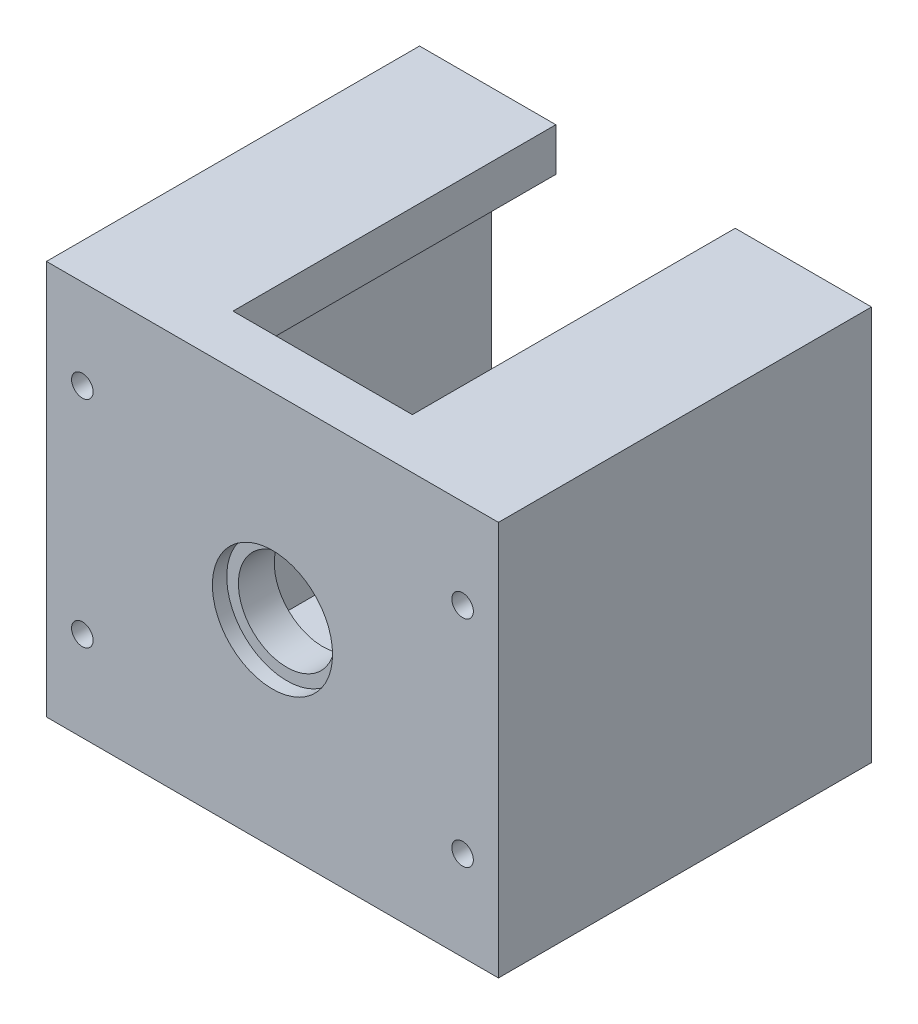
ISO-10303-21;
HEADER;
FILE_DESCRIPTION(('STEP AP214'),'2;1');
FILE_NAME('part.step','',(''),(''),'','','');
FILE_SCHEMA(('AUTOMOTIVE_DESIGN { 1 0 10303 214 1 1 1 1 }'));
ENDSEC;
DATA;
#1=APPLICATION_CONTEXT('core data for automotive mechanical design processes');
#2=APPLICATION_PROTOCOL_DEFINITION('international standard','automotive_design',2000,#1);
#3=PRODUCT_CONTEXT('',#1,'mechanical');
#4=PRODUCT('Part','Part','',(#3));
#5=PRODUCT_RELATED_PRODUCT_CATEGORY('part','',(#4));
#6=PRODUCT_DEFINITION_FORMATION('','',#4);
#7=PRODUCT_DEFINITION_CONTEXT('part definition',#1,'design');
#8=PRODUCT_DEFINITION('design','',#6,#7);
#9=PRODUCT_DEFINITION_SHAPE('','',#8);
#10=(LENGTH_UNIT() NAMED_UNIT(*) SI_UNIT(.MILLI.,.METRE.));
#11=(NAMED_UNIT(*) PLANE_ANGLE_UNIT() SI_UNIT($,.RADIAN.));
#12=(NAMED_UNIT(*) SI_UNIT($,.STERADIAN.) SOLID_ANGLE_UNIT());
#13=UNCERTAINTY_MEASURE_WITH_UNIT(LENGTH_MEASURE(1.E-05),#10,'distance_accuracy_value','');
#14=(GEOMETRIC_REPRESENTATION_CONTEXT(3) GLOBAL_UNCERTAINTY_ASSIGNED_CONTEXT((#13)) GLOBAL_UNIT_ASSIGNED_CONTEXT((#10,
#11,#12)) REPRESENTATION_CONTEXT('',''));
#15=CARTESIAN_POINT('',(0.,0.,0.));
#16=DIRECTION('',(0.,0.,1.));
#17=DIRECTION('',(1.,0.,0.));
#18=AXIS2_PLACEMENT_3D('',#15,#16,#17);
#19=CARTESIAN_POINT('',(0.,43.,-45.));
#20=DIRECTION('',(0.,-1.,0.));
#21=DIRECTION('',(0.,0.,-1.));
#22=AXIS2_PLACEMENT_3D('',#19,#20,#21);
#23=PLANE('',#22);
#24=DIRECTION('',(1.,0.,0.));
#25=VECTOR('',#24,1.);
#26=CARTESIAN_POINT('',(0.,43.,-45.));
#27=LINE('',#26,#25);
#28=CARTESIAN_POINT('',(0.,43.,-45.));
#29=VERTEX_POINT('',#28);
#30=CARTESIAN_POINT('',(8.99999999999999,43.,-45.));
#31=VERTEX_POINT('',#30);
#32=EDGE_CURVE('E229',#29,#31,#27,.T.);
#33=ORIENTED_EDGE('',*,*,#32,.T.);
#34=DIRECTION('',(0.,0.,1.));
#35=VECTOR('',#34,1.);
#36=CARTESIAN_POINT('',(8.99999999999999,43.,0.));
#37=LINE('',#36,#35);
#38=CARTESIAN_POINT('',(8.99999999999999,43.,0.));
#39=VERTEX_POINT('',#38);
#40=EDGE_CURVE('E50',#31,#39,#37,.T.);
#41=ORIENTED_EDGE('',*,*,#40,.T.);
#42=DIRECTION('',(1.,0.,0.));
#43=VECTOR('',#42,1.);
#44=CARTESIAN_POINT('',(0.,43.,0.));
#45=LINE('',#44,#43);
#46=CARTESIAN_POINT('',(0.,43.,0.));
#47=VERTEX_POINT('',#46);
#48=EDGE_CURVE('E170',#47,#39,#45,.T.);
#49=ORIENTED_EDGE('',*,*,#48,.F.);
#50=DIRECTION('',(0.,0.,1.));
#51=VECTOR('',#50,1.);
#52=CARTESIAN_POINT('',(0.,43.,-45.));
#53=LINE('',#52,#51);
#54=EDGE_CURVE('E177',#29,#47,#53,.T.);
#55=ORIENTED_EDGE('',*,*,#54,.F.);
#56=EDGE_LOOP('',(#33,#41,#49,#55));
#57=FACE_BOUND('',#56,.T.);
#58=ADVANCED_FACE('F35',(#57),#23,.T.);
#59=CARTESIAN_POINT('',(0.,0.,0.));
#60=DIRECTION('',(0.,0.,1.));
#61=DIRECTION('',(1.,0.,0.));
#62=AXIS2_PLACEMENT_3D('',#59,#60,#61);
#63=PLANE('',#62);
#64=DIRECTION('',(0.,1.,0.));
#65=VECTOR('',#64,1.);
#66=CARTESIAN_POINT('',(43.,0.,0.));
#67=LINE('',#66,#65);
#68=CARTESIAN_POINT('',(43.,0.,0.));
#69=VERTEX_POINT('',#68);
#70=CARTESIAN_POINT('',(43.,43.,0.));
#71=VERTEX_POINT('',#70);
#72=EDGE_CURVE('E161',#69,#71,#67,.T.);
#73=ORIENTED_EDGE('',*,*,#72,.F.);
#74=DIRECTION('',(1.,0.,0.));
#75=VECTOR('',#74,1.);
#76=CARTESIAN_POINT('',(0.,0.,0.));
#77=LINE('',#76,#75);
#78=CARTESIAN_POINT('',(0.,0.,0.));
#79=VERTEX_POINT('',#78);
#80=EDGE_CURVE('E164',#79,#69,#77,.T.);
#81=ORIENTED_EDGE('',*,*,#80,.F.);
#82=DIRECTION('',(0.,1.,0.));
#83=VECTOR('',#82,1.);
#84=CARTESIAN_POINT('',(0.,0.,0.));
#85=LINE('',#84,#83);
#86=EDGE_CURVE('E168',#79,#47,#85,.T.);
#87=ORIENTED_EDGE('',*,*,#86,.T.);
#88=ORIENTED_EDGE('',*,*,#48,.T.);
#89=DIRECTION('',(0.,-1.,0.));
#90=VECTOR('',#89,1.);
#91=CARTESIAN_POINT('',(8.99999999999999,100.478150704935,0.));
#92=LINE('',#91,#90);
#93=CARTESIAN_POINT('',(8.99999999999999,49.,0.));
#94=VERTEX_POINT('',#93);
#95=EDGE_CURVE('E253',#94,#39,#92,.T.);
#96=ORIENTED_EDGE('',*,*,#95,.F.);
#97=DIRECTION('',(-1.,0.,0.));
#98=VECTOR('',#97,1.);
#99=CARTESIAN_POINT('',(0.,49.,0.));
#100=LINE('',#99,#98);
#101=CARTESIAN_POINT('',(34.,49.,0.));
#102=VERTEX_POINT('',#101);
#103=EDGE_CURVE('E140',#102,#94,#100,.T.);
#104=ORIENTED_EDGE('',*,*,#103,.F.);
#105=DIRECTION('',(0.,-1.,0.));
#106=VECTOR('',#105,1.);
#107=CARTESIAN_POINT('',(34.,100.478150704935,0.));
#108=LINE('',#107,#106);
#109=CARTESIAN_POINT('',(34.,43.,0.));
#110=VERTEX_POINT('',#109);
#111=EDGE_CURVE('E257',#102,#110,#108,.T.);
#112=ORIENTED_EDGE('',*,*,#111,.T.);
#113=EDGE_CURVE('E58',#110,#71,#45,.T.);
#114=ORIENTED_EDGE('',*,*,#113,.T.);
#115=EDGE_LOOP('',(#73,#81,#87,#88,#96,#104,#112,#114));
#116=FACE_BOUND('',#115,.T.);
#117=CARTESIAN_POINT('',(21.5,21.5,0.));
#118=DIRECTION('',(0.,0.,1.));
#119=DIRECTION('',(1.,0.,0.));
#120=AXIS2_PLACEMENT_3D('',#117,#118,#119);
#121=CIRCLE('',#120,6.75);
#122=CARTESIAN_POINT('',(28.25,21.5,0.));
#123=VERTEX_POINT('',#122);
#124=EDGE_CURVE('E141',#123,#123,#121,.T.);
#125=ORIENTED_EDGE('',*,*,#124,.T.);
#126=EDGE_LOOP('',(#125));
#127=FACE_BOUND('',#126,.T.);
#128=ADVANCED_FACE('F273',(#116,#127),#63,.F.);
#129=CARTESIAN_POINT('',(0.,-6.00000000000001,7.));
#130=DIRECTION('',(0.,1.,0.));
#131=DIRECTION('',(-1.,0.,0.));
#132=AXIS2_PLACEMENT_3D('',#129,#130,#131);
#133=PLANE('',#132);
#134=DIRECTION('',(0.,0.,-1.));
#135=VECTOR('',#134,1.);
#136=CARTESIAN_POINT('',(-10.,-6.00000000000001,7.));
#137=LINE('',#136,#135);
#138=CARTESIAN_POINT('',(-10.,-6.00000000000001,7.));
#139=VERTEX_POINT('',#138);
#140=CARTESIAN_POINT('',(-10.,-6.00000000000001,-45.));
#141=VERTEX_POINT('',#140);
#142=EDGE_CURVE('E210',#139,#141,#137,.T.);
#143=ORIENTED_EDGE('',*,*,#142,.T.);
#144=DIRECTION('',(1.,0.,0.));
#145=VECTOR('',#144,1.);
#146=CARTESIAN_POINT('',(0.,-6.00000000000001,-45.));
#147=LINE('',#146,#145);
#148=CARTESIAN_POINT('',(53.,-6.,-45.));
#149=VERTEX_POINT('',#148);
#150=EDGE_CURVE('E225',#141,#149,#147,.T.);
#151=ORIENTED_EDGE('',*,*,#150,.T.);
#152=DIRECTION('',(0.,0.,-1.));
#153=VECTOR('',#152,1.);
#154=CARTESIAN_POINT('',(53.,-6.,7.));
#155=LINE('',#154,#153);
#156=CARTESIAN_POINT('',(53.,-6.,7.));
#157=VERTEX_POINT('',#156);
#158=EDGE_CURVE('E43',#157,#149,#155,.T.);
#159=ORIENTED_EDGE('',*,*,#158,.F.);
#160=DIRECTION('',(1.,0.,0.));
#161=VECTOR('',#160,1.);
#162=CARTESIAN_POINT('',(0.,-6.00000000000001,7.));
#163=LINE('',#162,#161);
#164=EDGE_CURVE('E193',#139,#157,#163,.T.);
#165=ORIENTED_EDGE('',*,*,#164,.F.);
#166=EDGE_LOOP('',(#143,#151,#159,#165));
#167=FACE_BOUND('',#166,.T.);
#168=ADVANCED_FACE('F228',(#167),#133,.F.);
#169=CARTESIAN_POINT('',(53.,0.,7.));
#170=DIRECTION('',(-1.,0.,0.));
#171=DIRECTION('',(0.,-1.,0.));
#172=AXIS2_PLACEMENT_3D('',#169,#170,#171);
#173=PLANE('',#172);
#174=ORIENTED_EDGE('',*,*,#158,.T.);
#175=DIRECTION('',(0.,1.,0.));
#176=VECTOR('',#175,1.);
#177=CARTESIAN_POINT('',(53.,0.,-45.));
#178=LINE('',#177,#176);
#179=CARTESIAN_POINT('',(53.,49.,-45.));
#180=VERTEX_POINT('',#179);
#181=EDGE_CURVE('E154',#149,#180,#178,.T.);
#182=ORIENTED_EDGE('',*,*,#181,.T.);
#183=DIRECTION('',(0.,0.,-1.));
#184=VECTOR('',#183,1.);
#185=CARTESIAN_POINT('',(53.,49.,7.));
#186=LINE('',#185,#184);
#187=CARTESIAN_POINT('',(53.,49.,7.));
#188=VERTEX_POINT('',#187);
#189=EDGE_CURVE('E214',#188,#180,#186,.T.);
#190=ORIENTED_EDGE('',*,*,#189,.F.);
#191=DIRECTION('',(0.,1.,0.));
#192=VECTOR('',#191,1.);
#193=CARTESIAN_POINT('',(53.,0.,7.));
#194=LINE('',#193,#192);
#195=EDGE_CURVE('E196',#157,#188,#194,.T.);
#196=ORIENTED_EDGE('',*,*,#195,.F.);
#197=EDGE_LOOP('',(#174,#182,#190,#196));
#198=FACE_BOUND('',#197,.T.);
#199=ADVANCED_FACE('F220',(#198),#173,.F.);
#200=CARTESIAN_POINT('',(0.,49.,7.));
#201=DIRECTION('',(0.,1.,0.));
#202=DIRECTION('',(-1.,0.,0.));
#203=AXIS2_PLACEMENT_3D('',#200,#201,#202);
#204=PLANE('',#203);
#205=DIRECTION('',(0.,0.,1.));
#206=VECTOR('',#205,1.);
#207=CARTESIAN_POINT('',(34.,49.,0.));
#208=LINE('',#207,#206);
#209=CARTESIAN_POINT('',(34.,49.,-45.));
#210=VERTEX_POINT('',#209);
#211=EDGE_CURVE('E254',#210,#102,#208,.T.);
#212=ORIENTED_EDGE('',*,*,#211,.T.);
#213=ORIENTED_EDGE('',*,*,#103,.T.);
#214=DIRECTION('',(0.,0.,1.));
#215=VECTOR('',#214,1.);
#216=CARTESIAN_POINT('',(8.99999999999999,49.,0.));
#217=LINE('',#216,#215);
#218=CARTESIAN_POINT('',(8.99999999999999,49.,-45.));
#219=VERTEX_POINT('',#218);
#220=EDGE_CURVE('E125',#219,#94,#217,.T.);
#221=ORIENTED_EDGE('',*,*,#220,.F.);
#222=DIRECTION('',(1.,0.,0.));
#223=VECTOR('',#222,1.);
#224=CARTESIAN_POINT('',(0.,49.,-45.));
#225=LINE('',#224,#223);
#226=CARTESIAN_POINT('',(-10.,49.,-45.));
#227=VERTEX_POINT('',#226);
#228=EDGE_CURVE('E137',#227,#219,#225,.T.);
#229=ORIENTED_EDGE('',*,*,#228,.F.);
#230=DIRECTION('',(0.,0.,-1.));
#231=VECTOR('',#230,1.);
#232=CARTESIAN_POINT('',(-10.,49.,7.));
#233=LINE('',#232,#231);
#234=CARTESIAN_POINT('',(-10.,49.,7.));
#235=VERTEX_POINT('',#234);
#236=EDGE_CURVE('E212',#235,#227,#233,.T.);
#237=ORIENTED_EDGE('',*,*,#236,.F.);
#238=DIRECTION('',(1.,0.,0.));
#239=VECTOR('',#238,1.);
#240=CARTESIAN_POINT('',(0.,49.,7.));
#241=LINE('',#240,#239);
#242=EDGE_CURVE('E198',#235,#188,#241,.T.);
#243=ORIENTED_EDGE('',*,*,#242,.T.);
#244=ORIENTED_EDGE('',*,*,#189,.T.);
#245=EDGE_CURVE('E150',#210,#180,#225,.T.);
#246=ORIENTED_EDGE('',*,*,#245,.F.);
#247=EDGE_LOOP('',(#212,#213,#221,#229,#237,#243,#244,#246));
#248=FACE_BOUND('',#247,.T.);
#249=ADVANCED_FACE('F136',(#248),#204,.T.);
#250=CARTESIAN_POINT('',(48.,36.5,7.));
#251=DIRECTION('',(0.,0.,-1.));
#252=DIRECTION('',(-1.,0.,0.));
#253=AXIS2_PLACEMENT_3D('',#250,#251,#252);
#254=CYLINDRICAL_SURFACE('',#253,1.50000000000001);
#255=CARTESIAN_POINT('',(48.,36.5,7.));
#256=DIRECTION('',(0.,0.,1.));
#257=DIRECTION('',(1.,0.,0.));
#258=AXIS2_PLACEMENT_3D('',#255,#256,#257);
#259=CIRCLE('',#258,1.50000000000001);
#260=CARTESIAN_POINT('',(49.5,36.5,7.));
#261=VERTEX_POINT('',#260);
#262=EDGE_CURVE('E204',#261,#261,#259,.F.);
#263=ORIENTED_EDGE('',*,*,#262,.F.);
#264=EDGE_LOOP('',(#263));
#265=FACE_BOUND('',#264,.T.);
#266=CARTESIAN_POINT('',(48.,36.5,-45.));
#267=DIRECTION('',(0.,0.,1.));
#268=DIRECTION('',(1.,0.,0.));
#269=AXIS2_PLACEMENT_3D('',#266,#267,#268);
#270=CIRCLE('',#269,1.50000000000001);
#271=CARTESIAN_POINT('',(49.5,36.5,-45.));
#272=VERTEX_POINT('',#271);
#273=EDGE_CURVE('E152',#272,#272,#270,.F.);
#274=ORIENTED_EDGE('',*,*,#273,.T.);
#275=EDGE_LOOP('',(#274));
#276=FACE_BOUND('',#275,.T.);
#277=ADVANCED_FACE('F293',(#265,#276),#254,.F.);
#278=CARTESIAN_POINT('',(-10.,0.,7.));
#279=DIRECTION('',(-1.,0.,0.));
#280=DIRECTION('',(0.,-1.,0.));
#281=AXIS2_PLACEMENT_3D('',#278,#279,#280);
#282=PLANE('',#281);
#283=ORIENTED_EDGE('',*,*,#236,.T.);
#284=DIRECTION('',(0.,1.,0.));
#285=VECTOR('',#284,1.);
#286=CARTESIAN_POINT('',(-10.,0.,-45.));
#287=LINE('',#286,#285);
#288=EDGE_CURVE('E149',#141,#227,#287,.T.);
#289=ORIENTED_EDGE('',*,*,#288,.F.);
#290=ORIENTED_EDGE('',*,*,#142,.F.);
#291=DIRECTION('',(0.,1.,0.));
#292=VECTOR('',#291,1.);
#293=CARTESIAN_POINT('',(-10.,0.,7.));
#294=LINE('',#293,#292);
#295=EDGE_CURVE('E201',#139,#235,#294,.T.);
#296=ORIENTED_EDGE('',*,*,#295,.T.);
#297=EDGE_LOOP('',(#283,#289,#290,#296));
#298=FACE_BOUND('',#297,.T.);
#299=ADVANCED_FACE('F290',(#298),#282,.T.);
#300=CARTESIAN_POINT('',(-5.,36.5,7.));
#301=DIRECTION('',(0.,0.,-1.));
#302=DIRECTION('',(-1.,0.,0.));
#303=AXIS2_PLACEMENT_3D('',#300,#301,#302);
#304=CYLINDRICAL_SURFACE('',#303,1.5);
#305=CARTESIAN_POINT('',(-5.,36.5,7.));
#306=DIRECTION('',(0.,0.,1.));
#307=DIRECTION('',(1.,0.,0.));
#308=AXIS2_PLACEMENT_3D('',#305,#306,#307);
#309=CIRCLE('',#308,1.5);
#310=CARTESIAN_POINT('',(-3.5,36.5,7.));
#311=VERTEX_POINT('',#310);
#312=EDGE_CURVE('E190',#311,#311,#309,.T.);
#313=ORIENTED_EDGE('',*,*,#312,.T.);
#314=EDGE_LOOP('',(#313));
#315=FACE_BOUND('',#314,.T.);
#316=CARTESIAN_POINT('',(-5.,36.5,-45.));
#317=DIRECTION('',(0.,0.,1.));
#318=DIRECTION('',(1.,0.,0.));
#319=AXIS2_PLACEMENT_3D('',#316,#317,#318);
#320=CIRCLE('',#319,1.5);
#321=CARTESIAN_POINT('',(-3.5,36.5,-45.));
#322=VERTEX_POINT('',#321);
#323=EDGE_CURVE('E241',#322,#322,#320,.T.);
#324=ORIENTED_EDGE('',*,*,#323,.F.);
#325=EDGE_LOOP('',(#324));
#326=FACE_BOUND('',#325,.T.);
#327=ADVANCED_FACE('F292',(#315,#326),#304,.F.);
#328=CARTESIAN_POINT('',(-5.,6.49999999999999,7.));
#329=DIRECTION('',(0.,0.,-1.));
#330=DIRECTION('',(-1.,0.,0.));
#331=AXIS2_PLACEMENT_3D('',#328,#329,#330);
#332=CYLINDRICAL_SURFACE('',#331,1.5);
#333=CARTESIAN_POINT('',(-5.,6.49999999999999,7.));
#334=DIRECTION('',(0.,0.,1.));
#335=DIRECTION('',(1.,0.,0.));
#336=AXIS2_PLACEMENT_3D('',#333,#334,#335);
#337=CIRCLE('',#336,1.5);
#338=CARTESIAN_POINT('',(-3.5,6.49999999999999,7.));
#339=VERTEX_POINT('',#338);
#340=EDGE_CURVE('E187',#339,#339,#337,.T.);
#341=ORIENTED_EDGE('',*,*,#340,.T.);
#342=EDGE_LOOP('',(#341));
#343=FACE_BOUND('',#342,.T.);
#344=CARTESIAN_POINT('',(-5.,6.49999999999999,-45.));
#345=DIRECTION('',(0.,0.,1.));
#346=DIRECTION('',(1.,0.,0.));
#347=AXIS2_PLACEMENT_3D('',#344,#345,#346);
#348=CIRCLE('',#347,1.5);
#349=CARTESIAN_POINT('',(-3.5,6.49999999999999,-45.));
#350=VERTEX_POINT('',#349);
#351=EDGE_CURVE('E244',#350,#350,#348,.T.);
#352=ORIENTED_EDGE('',*,*,#351,.F.);
#353=EDGE_LOOP('',(#352));
#354=FACE_BOUND('',#353,.T.);
#355=ADVANCED_FACE('F299',(#343,#354),#332,.F.);
#356=CARTESIAN_POINT('',(48.,6.49999999999999,7.));
#357=DIRECTION('',(0.,0.,-1.));
#358=DIRECTION('',(-1.,0.,0.));
#359=AXIS2_PLACEMENT_3D('',#356,#357,#358);
#360=CYLINDRICAL_SURFACE('',#359,1.5);
#361=CARTESIAN_POINT('',(48.,6.49999999999999,7.));
#362=DIRECTION('',(0.,0.,1.));
#363=DIRECTION('',(1.,0.,0.));
#364=AXIS2_PLACEMENT_3D('',#361,#362,#363);
#365=CIRCLE('',#364,1.5);
#366=CARTESIAN_POINT('',(49.5,6.49999999999999,7.));
#367=VERTEX_POINT('',#366);
#368=EDGE_CURVE('E176',#367,#367,#365,.F.);
#369=ORIENTED_EDGE('',*,*,#368,.F.);
#370=EDGE_LOOP('',(#369));
#371=FACE_BOUND('',#370,.T.);
#372=CARTESIAN_POINT('',(48.,6.49999999999999,-45.));
#373=DIRECTION('',(0.,0.,1.));
#374=DIRECTION('',(1.,0.,0.));
#375=AXIS2_PLACEMENT_3D('',#372,#373,#374);
#376=CIRCLE('',#375,1.5);
#377=CARTESIAN_POINT('',(49.5,6.49999999999999,-45.));
#378=VERTEX_POINT('',#377);
#379=EDGE_CURVE('E173',#378,#378,#376,.F.);
#380=ORIENTED_EDGE('',*,*,#379,.T.);
#381=EDGE_LOOP('',(#380));
#382=FACE_BOUND('',#381,.T.);
#383=ADVANCED_FACE('F37',(#371,#382),#360,.F.);
#384=CARTESIAN_POINT('',(21.5,21.5,7.));
#385=DIRECTION('',(0.,0.,-1.));
#386=DIRECTION('',(-1.,0.,0.));
#387=AXIS2_PLACEMENT_3D('',#384,#385,#386);
#388=CYLINDRICAL_SURFACE('',#387,8.375);
#389=CARTESIAN_POINT('',(21.5,21.5,5.));
#390=DIRECTION('',(0.,0.,1.));
#391=DIRECTION('',(1.,0.,0.));
#392=AXIS2_PLACEMENT_3D('',#389,#390,#391);
#393=CIRCLE('',#392,8.375);
#394=CARTESIAN_POINT('',(29.875,21.5,5.));
#395=VERTEX_POINT('',#394);
#396=EDGE_CURVE('E11',#395,#395,#393,.T.);
#397=ORIENTED_EDGE('',*,*,#396,.F.);
#398=EDGE_LOOP('',(#397));
#399=FACE_BOUND('',#398,.T.);
#400=CARTESIAN_POINT('',(21.5,21.5,7.));
#401=DIRECTION('',(0.,0.,1.));
#402=DIRECTION('',(1.,0.,0.));
#403=AXIS2_PLACEMENT_3D('',#400,#401,#402);
#404=CIRCLE('',#403,8.375);
#405=CARTESIAN_POINT('',(29.875,21.5,7.));
#406=VERTEX_POINT('',#405);
#407=EDGE_CURVE('E207',#406,#406,#404,.T.);
#408=ORIENTED_EDGE('',*,*,#407,.T.);
#409=EDGE_LOOP('',(#408));
#410=FACE_BOUND('',#409,.T.);
#411=ADVANCED_FACE('F322',(#399,#410),#388,.F.);
#412=CARTESIAN_POINT('',(0.,0.,7.));
#413=DIRECTION('',(0.,0.,1.));
#414=DIRECTION('',(1.,0.,0.));
#415=AXIS2_PLACEMENT_3D('',#412,#413,#414);
#416=PLANE('',#415);
#417=ORIENTED_EDGE('',*,*,#368,.T.);
#418=EDGE_LOOP('',(#417));
#419=FACE_BOUND('',#418,.T.);
#420=ORIENTED_EDGE('',*,*,#340,.F.);
#421=EDGE_LOOP('',(#420));
#422=FACE_BOUND('',#421,.T.);
#423=ORIENTED_EDGE('',*,*,#312,.F.);
#424=EDGE_LOOP('',(#423));
#425=FACE_BOUND('',#424,.T.);
#426=ORIENTED_EDGE('',*,*,#164,.T.);
#427=ORIENTED_EDGE('',*,*,#195,.T.);
#428=ORIENTED_EDGE('',*,*,#242,.F.);
#429=ORIENTED_EDGE('',*,*,#295,.F.);
#430=EDGE_LOOP('',(#426,#427,#428,#429));
#431=FACE_BOUND('',#430,.T.);
#432=ORIENTED_EDGE('',*,*,#262,.T.);
#433=EDGE_LOOP('',(#432));
#434=FACE_BOUND('',#433,.T.);
#435=ORIENTED_EDGE('',*,*,#407,.F.);
#436=EDGE_LOOP('',(#435));
#437=FACE_BOUND('',#436,.T.);
#438=ADVANCED_FACE('F287',(#419,#422,#425,#431,#434,#437),#416,.T.);
#439=CARTESIAN_POINT('',(43.,0.,-45.));
#440=DIRECTION('',(1.,0.,0.));
#441=DIRECTION('',(0.,0.,-1.));
#442=AXIS2_PLACEMENT_3D('',#439,#440,#441);
#443=PLANE('',#442);
#444=ORIENTED_EDGE('',*,*,#72,.T.);
#445=DIRECTION('',(0.,0.,1.));
#446=VECTOR('',#445,1.);
#447=CARTESIAN_POINT('',(43.,43.,-45.));
#448=LINE('',#447,#446);
#449=CARTESIAN_POINT('',(43.,43.,-45.));
#450=VERTEX_POINT('',#449);
#451=EDGE_CURVE('E174',#450,#71,#448,.T.);
#452=ORIENTED_EDGE('',*,*,#451,.F.);
#453=DIRECTION('',(0.,1.,0.));
#454=VECTOR('',#453,1.);
#455=CARTESIAN_POINT('',(43.,0.,-45.));
#456=LINE('',#455,#454);
#457=CARTESIAN_POINT('',(43.,0.,-45.));
#458=VERTEX_POINT('',#457);
#459=EDGE_CURVE('E238',#458,#450,#456,.T.);
#460=ORIENTED_EDGE('',*,*,#459,.F.);
#461=DIRECTION('',(0.,0.,1.));
#462=VECTOR('',#461,1.);
#463=CARTESIAN_POINT('',(43.,0.,-45.));
#464=LINE('',#463,#462);
#465=EDGE_CURVE('E160',#458,#69,#464,.T.);
#466=ORIENTED_EDGE('',*,*,#465,.T.);
#467=EDGE_LOOP('',(#444,#452,#460,#466));
#468=FACE_BOUND('',#467,.T.);
#469=ADVANCED_FACE('F271',(#468),#443,.F.);
#470=DIRECTION('',(0.,0.,1.));
#471=VECTOR('',#470,1.);
#472=CARTESIAN_POINT('',(34.,43.,0.));
#473=LINE('',#472,#471);
#474=CARTESIAN_POINT('',(34.,43.,-45.));
#475=VERTEX_POINT('',#474);
#476=EDGE_CURVE('E142',#475,#110,#473,.T.);
#477=ORIENTED_EDGE('',*,*,#476,.F.);
#478=EDGE_CURVE('E230',#475,#450,#27,.T.);
#479=ORIENTED_EDGE('',*,*,#478,.T.);
#480=ORIENTED_EDGE('',*,*,#451,.T.);
#481=ORIENTED_EDGE('',*,*,#113,.F.);
#482=EDGE_LOOP('',(#477,#479,#480,#481));
#483=FACE_BOUND('',#482,.T.);
#484=ADVANCED_FACE('F267',(#483),#23,.T.);
#485=CARTESIAN_POINT('',(0.,0.,-45.));
#486=DIRECTION('',(1.,0.,0.));
#487=DIRECTION('',(0.,0.,-1.));
#488=AXIS2_PLACEMENT_3D('',#485,#486,#487);
#489=PLANE('',#488);
#490=ORIENTED_EDGE('',*,*,#86,.F.);
#491=DIRECTION('',(0.,0.,1.));
#492=VECTOR('',#491,1.);
#493=CARTESIAN_POINT('',(0.,0.,-45.));
#494=LINE('',#493,#492);
#495=CARTESIAN_POINT('',(0.,0.,-45.));
#496=VERTEX_POINT('',#495);
#497=EDGE_CURVE('E180',#496,#79,#494,.T.);
#498=ORIENTED_EDGE('',*,*,#497,.F.);
#499=DIRECTION('',(0.,1.,0.));
#500=VECTOR('',#499,1.);
#501=CARTESIAN_POINT('',(0.,0.,-45.));
#502=LINE('',#501,#500);
#503=EDGE_CURVE('E233',#496,#29,#502,.T.);
#504=ORIENTED_EDGE('',*,*,#503,.T.);
#505=ORIENTED_EDGE('',*,*,#54,.T.);
#506=EDGE_LOOP('',(#490,#498,#504,#505));
#507=FACE_BOUND('',#506,.T.);
#508=ADVANCED_FACE('F281',(#507),#489,.T.);
#509=CARTESIAN_POINT('',(0.,0.,-45.));
#510=DIRECTION('',(0.,-1.,0.));
#511=DIRECTION('',(0.,0.,-1.));
#512=AXIS2_PLACEMENT_3D('',#509,#510,#511);
#513=PLANE('',#512);
#514=ORIENTED_EDGE('',*,*,#80,.T.);
#515=ORIENTED_EDGE('',*,*,#465,.F.);
#516=DIRECTION('',(1.,0.,0.));
#517=VECTOR('',#516,1.);
#518=CARTESIAN_POINT('',(0.,0.,-45.));
#519=LINE('',#518,#517);
#520=EDGE_CURVE('E236',#496,#458,#519,.T.);
#521=ORIENTED_EDGE('',*,*,#520,.F.);
#522=ORIENTED_EDGE('',*,*,#497,.T.);
#523=EDGE_LOOP('',(#514,#515,#521,#522));
#524=FACE_BOUND('',#523,.T.);
#525=ADVANCED_FACE('F276',(#524),#513,.F.);
#526=CARTESIAN_POINT('',(0.,0.,-45.));
#527=DIRECTION('',(0.,0.,1.));
#528=DIRECTION('',(1.,0.,0.));
#529=AXIS2_PLACEMENT_3D('',#526,#527,#528);
#530=PLANE('',#529);
#531=ORIENTED_EDGE('',*,*,#379,.F.);
#532=EDGE_LOOP('',(#531));
#533=FACE_BOUND('',#532,.T.);
#534=ORIENTED_EDGE('',*,*,#351,.T.);
#535=EDGE_LOOP('',(#534));
#536=FACE_BOUND('',#535,.T.);
#537=ORIENTED_EDGE('',*,*,#323,.T.);
#538=EDGE_LOOP('',(#537));
#539=FACE_BOUND('',#538,.T.);
#540=ORIENTED_EDGE('',*,*,#478,.F.);
#541=DIRECTION('',(0.,-1.,0.));
#542=VECTOR('',#541,1.);
#543=CARTESIAN_POINT('',(34.,100.478150704935,-45.));
#544=LINE('',#543,#542);
#545=EDGE_CURVE('E131',#210,#475,#544,.T.);
#546=ORIENTED_EDGE('',*,*,#545,.F.);
#547=ORIENTED_EDGE('',*,*,#245,.T.);
#548=ORIENTED_EDGE('',*,*,#181,.F.);
#549=ORIENTED_EDGE('',*,*,#150,.F.);
#550=ORIENTED_EDGE('',*,*,#288,.T.);
#551=ORIENTED_EDGE('',*,*,#228,.T.);
#552=DIRECTION('',(0.,-1.,0.));
#553=VECTOR('',#552,1.);
#554=CARTESIAN_POINT('',(8.99999999999999,100.478150704935,-45.));
#555=LINE('',#554,#553);
#556=EDGE_CURVE('E122',#219,#31,#555,.T.);
#557=ORIENTED_EDGE('',*,*,#556,.T.);
#558=ORIENTED_EDGE('',*,*,#32,.F.);
#559=ORIENTED_EDGE('',*,*,#503,.F.);
#560=ORIENTED_EDGE('',*,*,#520,.T.);
#561=ORIENTED_EDGE('',*,*,#459,.T.);
#562=EDGE_LOOP('',(#540,#546,#547,#548,#549,#550,#551,#557,#558,#559,#560,#561));
#563=FACE_BOUND('',#562,.T.);
#564=ORIENTED_EDGE('',*,*,#273,.F.);
#565=EDGE_LOOP('',(#564));
#566=FACE_BOUND('',#565,.T.);
#567=ADVANCED_FACE('F145',(#533,#536,#539,#563,#566),#530,.F.);
#568=CARTESIAN_POINT('',(21.5,21.5,5.));
#569=DIRECTION('',(0.,0.,-1.));
#570=DIRECTION('',(-1.,0.,0.));
#571=AXIS2_PLACEMENT_3D('',#568,#569,#570);
#572=CYLINDRICAL_SURFACE('',#571,6.75);
#573=CARTESIAN_POINT('',(21.5,21.5,5.));
#574=DIRECTION('',(0.,0.,1.));
#575=DIRECTION('',(1.,0.,0.));
#576=AXIS2_PLACEMENT_3D('',#573,#574,#575);
#577=CIRCLE('',#576,6.75);
#578=CARTESIAN_POINT('',(28.25,21.5,5.));
#579=VERTEX_POINT('',#578);
#580=EDGE_CURVE('E165',#579,#579,#577,.T.);
#581=ORIENTED_EDGE('',*,*,#580,.T.);
#582=EDGE_LOOP('',(#581));
#583=FACE_BOUND('',#582,.T.);
#584=ORIENTED_EDGE('',*,*,#124,.F.);
#585=EDGE_LOOP('',(#584));
#586=FACE_BOUND('',#585,.T.);
#587=ADVANCED_FACE('F340',(#583,#586),#572,.F.);
#588=CARTESIAN_POINT('',(0.,0.,5.));
#589=DIRECTION('',(0.,0.,1.));
#590=DIRECTION('',(1.,0.,0.));
#591=AXIS2_PLACEMENT_3D('',#588,#589,#590);
#592=PLANE('',#591);
#593=ORIENTED_EDGE('',*,*,#580,.F.);
#594=EDGE_LOOP('',(#593));
#595=FACE_BOUND('',#594,.T.);
#596=ORIENTED_EDGE('',*,*,#396,.T.);
#597=EDGE_LOOP('',(#596));
#598=FACE_BOUND('',#597,.T.);
#599=ADVANCED_FACE('F338',(#595,#598),#592,.T.);
#600=CARTESIAN_POINT('',(34.,100.478150704935,0.));
#601=DIRECTION('',(1.,0.,0.));
#602=DIRECTION('',(0.,0.,-1.));
#603=AXIS2_PLACEMENT_3D('',#600,#601,#602);
#604=PLANE('',#603);
#605=ORIENTED_EDGE('',*,*,#545,.T.);
#606=ORIENTED_EDGE('',*,*,#476,.T.);
#607=ORIENTED_EDGE('',*,*,#111,.F.);
#608=ORIENTED_EDGE('',*,*,#211,.F.);
#609=EDGE_LOOP('',(#605,#606,#607,#608));
#610=FACE_BOUND('',#609,.T.);
#611=ADVANCED_FACE('F265',(#610),#604,.F.);
#612=CARTESIAN_POINT('',(8.99999999999999,100.478150704935,0.));
#613=DIRECTION('',(1.,0.,0.));
#614=DIRECTION('',(0.,0.,-1.));
#615=AXIS2_PLACEMENT_3D('',#612,#613,#614);
#616=PLANE('',#615);
#617=ORIENTED_EDGE('',*,*,#220,.T.);
#618=ORIENTED_EDGE('',*,*,#95,.T.);
#619=ORIENTED_EDGE('',*,*,#40,.F.);
#620=ORIENTED_EDGE('',*,*,#556,.F.);
#621=EDGE_LOOP('',(#617,#618,#619,#620));
#622=FACE_BOUND('',#621,.T.);
#623=ADVANCED_FACE('F124',(#622),#616,.T.);
#624=CLOSED_SHELL('',(#58,#128,#168,#199,#249,#277,#299,#327,#355,#383,#411,#438,#469,#484,#508,
#525,#567,#587,#599,#611,#623));
#625=MANIFOLD_SOLID_BREP('B2',#624);
#626=ADVANCED_BREP_SHAPE_REPRESENTATION('',(#18,#625),#14);
#627=SHAPE_DEFINITION_REPRESENTATION(#9,#626);
ENDSEC;
END-ISO-10303-21;
